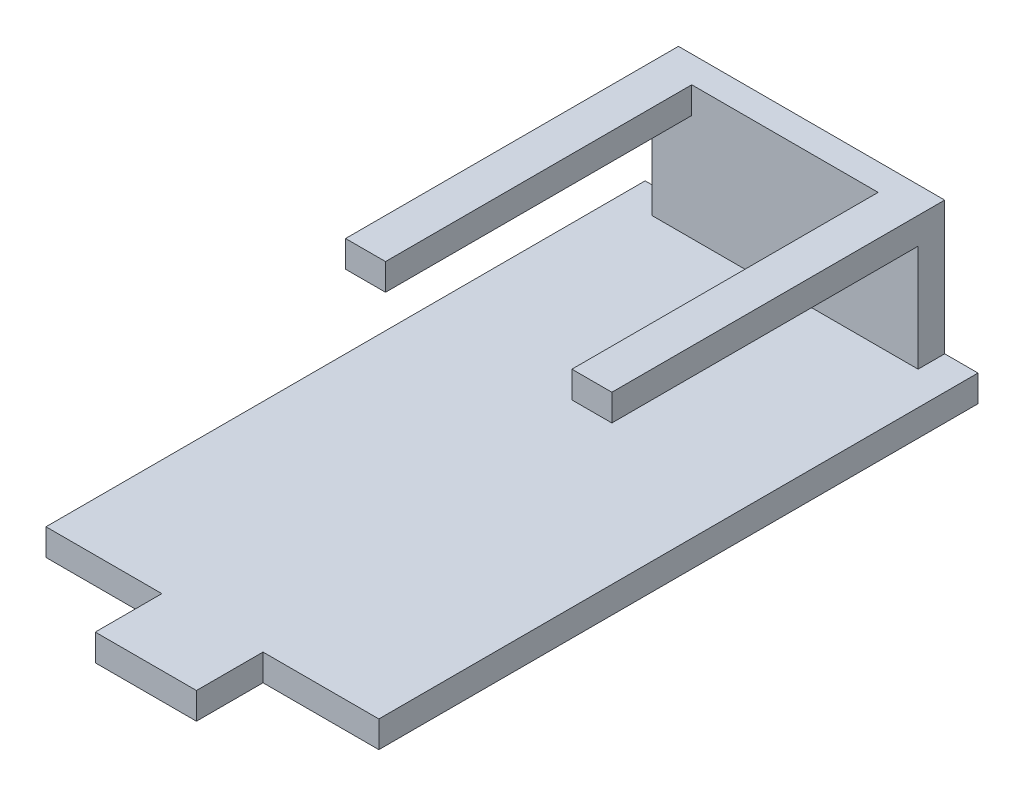
ISO-10303-21;
HEADER;
FILE_DESCRIPTION(('STEP AP214'),'2;1');
FILE_NAME('part.step','',(''),(''),'','','');
FILE_SCHEMA(('AUTOMOTIVE_DESIGN { 1 0 10303 214 1 1 1 1 }'));
ENDSEC;
DATA;
#1=APPLICATION_CONTEXT('core data for automotive mechanical design processes');
#2=APPLICATION_PROTOCOL_DEFINITION('international standard','automotive_design',2000,#1);
#3=PRODUCT_CONTEXT('',#1,'mechanical');
#4=PRODUCT('Part','Part','',(#3));
#5=PRODUCT_RELATED_PRODUCT_CATEGORY('part','',(#4));
#6=PRODUCT_DEFINITION_FORMATION('','',#4);
#7=PRODUCT_DEFINITION_CONTEXT('part definition',#1,'design');
#8=PRODUCT_DEFINITION('design','',#6,#7);
#9=PRODUCT_DEFINITION_SHAPE('','',#8);
#10=(LENGTH_UNIT() NAMED_UNIT(*) SI_UNIT(.MILLI.,.METRE.));
#11=(NAMED_UNIT(*) PLANE_ANGLE_UNIT() SI_UNIT($,.RADIAN.));
#12=(NAMED_UNIT(*) SI_UNIT($,.STERADIAN.) SOLID_ANGLE_UNIT());
#13=UNCERTAINTY_MEASURE_WITH_UNIT(LENGTH_MEASURE(1.E-05),#10,'distance_accuracy_value','');
#14=(GEOMETRIC_REPRESENTATION_CONTEXT(3) GLOBAL_UNCERTAINTY_ASSIGNED_CONTEXT((#13)) GLOBAL_UNIT_ASSIGNED_CONTEXT((#10,
#11,#12)) REPRESENTATION_CONTEXT('',''));
#15=CARTESIAN_POINT('',(0.,0.,0.));
#16=DIRECTION('',(0.,0.,1.));
#17=DIRECTION('',(1.,0.,0.));
#18=AXIS2_PLACEMENT_3D('',#15,#16,#17);
#19=CARTESIAN_POINT('',(-27.6262725772382,2.,-20.2907941728906));
#20=DIRECTION('',(1.,0.,0.));
#21=DIRECTION('',(0.,0.,-1.));
#22=AXIS2_PLACEMENT_3D('',#19,#20,#21);
#23=PLANE('',#22);
#24=DIRECTION('',(0.,-1.,0.));
#25=VECTOR('',#24,1.);
#26=CARTESIAN_POINT('',(-27.6262725772382,2.,24.7092058271093));
#27=LINE('',#26,#25);
#28=CARTESIAN_POINT('',(-27.6262725772382,2.,24.7092058271093));
#29=VERTEX_POINT('',#28);
#30=CARTESIAN_POINT('',(-27.6262725772382,0.,24.7092058271093));
#31=VERTEX_POINT('',#30);
#32=EDGE_CURVE('E57',#29,#31,#27,.T.);
#33=ORIENTED_EDGE('',*,*,#32,.F.);
#34=DIRECTION('',(0.,0.,1.));
#35=VECTOR('',#34,1.);
#36=CARTESIAN_POINT('',(-27.6262725772382,2.,-20.2907941728906));
#37=LINE('',#36,#35);
#38=CARTESIAN_POINT('',(-27.6262725772382,2.,-20.2907941728906));
#39=VERTEX_POINT('',#38);
#40=EDGE_CURVE('E266',#39,#29,#37,.T.);
#41=ORIENTED_EDGE('',*,*,#40,.F.);
#42=DIRECTION('',(0.,-1.,0.));
#43=VECTOR('',#42,1.);
#44=CARTESIAN_POINT('',(-27.6262725772382,2.,-20.2907941728906));
#45=LINE('',#44,#43);
#46=CARTESIAN_POINT('',(-27.6262725772382,0.,-20.2907941728906));
#47=VERTEX_POINT('',#46);
#48=EDGE_CURVE('E276',#39,#47,#45,.T.);
#49=ORIENTED_EDGE('',*,*,#48,.T.);
#50=DIRECTION('',(0.,0.,1.));
#51=VECTOR('',#50,1.);
#52=CARTESIAN_POINT('',(-27.6262725772382,0.,-20.2907941728906));
#53=LINE('',#52,#51);
#54=EDGE_CURVE('E265',#47,#31,#53,.T.);
#55=ORIENTED_EDGE('',*,*,#54,.T.);
#56=EDGE_LOOP('',(#33,#41,#49,#55));
#57=FACE_BOUND('',#56,.T.);
#58=ADVANCED_FACE('F35',(#57),#23,.F.);
#59=CARTESIAN_POINT('',(-25.1262725772382,10.,4.70920582710934));
#60=DIRECTION('',(0.,1.,0.));
#61=DIRECTION('',(0.,0.,1.));
#62=AXIS2_PLACEMENT_3D('',#59,#60,#61);
#63=PLANE('',#62);
#64=DIRECTION('',(1.,0.,0.));
#65=VECTOR('',#64,1.);
#66=CARTESIAN_POINT('',(-25.1262725772382,10.,-18.2907941728907));
#67=LINE('',#66,#65);
#68=CARTESIAN_POINT('',(-25.1262725772382,10.,-18.2907941728907));
#69=VERTEX_POINT('',#68);
#70=CARTESIAN_POINT('',(-22.1262725772382,10.,-18.2907941728907));
#71=VERTEX_POINT('',#70);
#72=EDGE_CURVE('E221',#69,#71,#67,.T.);
#73=ORIENTED_EDGE('',*,*,#72,.T.);
#74=DIRECTION('',(0.,0.,1.));
#75=VECTOR('',#74,1.);
#76=CARTESIAN_POINT('',(-22.1262725772382,10.,4.70920582710934));
#77=LINE('',#76,#75);
#78=CARTESIAN_POINT('',(-22.1262725772382,10.,4.70920582710934));
#79=VERTEX_POINT('',#78);
#80=EDGE_CURVE('E213',#71,#79,#77,.T.);
#81=ORIENTED_EDGE('',*,*,#80,.T.);
#82=DIRECTION('',(1.,0.,0.));
#83=VECTOR('',#82,1.);
#84=CARTESIAN_POINT('',(-25.1262725772382,10.,4.70920582710934));
#85=LINE('',#84,#83);
#86=CARTESIAN_POINT('',(-25.1262725772382,10.,4.70920582710934));
#87=VERTEX_POINT('',#86);
#88=EDGE_CURVE('E222',#87,#79,#85,.T.);
#89=ORIENTED_EDGE('',*,*,#88,.F.);
#90=DIRECTION('',(0.,0.,-1.));
#91=VECTOR('',#90,1.);
#92=CARTESIAN_POINT('',(-25.1262725772382,10.,4.70920582710934));
#93=LINE('',#92,#91);
#94=EDGE_CURVE('E237',#87,#69,#93,.T.);
#95=ORIENTED_EDGE('',*,*,#94,.T.);
#96=EDGE_LOOP('',(#73,#81,#89,#95));
#97=FACE_BOUND('',#96,.T.);
#98=ADVANCED_FACE('F334',(#97),#63,.F.);
#99=CARTESIAN_POINT('',(0.,0.,4.70920582710934));
#100=DIRECTION('',(0.,0.,1.));
#101=DIRECTION('',(1.,0.,0.));
#102=AXIS2_PLACEMENT_3D('',#99,#100,#101);
#103=PLANE('',#102);
#104=DIRECTION('',(0.,-1.,0.));
#105=VECTOR('',#104,1.);
#106=CARTESIAN_POINT('',(-22.1262725772382,0.,4.70920582710934));
#107=LINE('',#106,#105);
#108=CARTESIAN_POINT('',(-22.1262725772382,12.,4.70920582710934));
#109=VERTEX_POINT('',#108);
#110=EDGE_CURVE('E11',#109,#79,#107,.T.);
#111=ORIENTED_EDGE('',*,*,#110,.F.);
#112=DIRECTION('',(-1.,0.,0.));
#113=VECTOR('',#112,1.);
#114=CARTESIAN_POINT('',(-5.12627257723815,12.,4.70920582710934));
#115=LINE('',#114,#113);
#116=CARTESIAN_POINT('',(-25.1262725772382,12.,4.70920582710934));
#117=VERTEX_POINT('',#116);
#118=EDGE_CURVE('E228',#109,#117,#115,.T.);
#119=ORIENTED_EDGE('',*,*,#118,.T.);
#120=DIRECTION('',(0.,-1.,0.));
#121=VECTOR('',#120,1.);
#122=CARTESIAN_POINT('',(-25.1262725772382,12.,4.70920582710934));
#123=LINE('',#122,#121);
#124=EDGE_CURVE('E217',#117,#87,#123,.T.);
#125=ORIENTED_EDGE('',*,*,#124,.T.);
#126=ORIENTED_EDGE('',*,*,#88,.T.);
#127=EDGE_LOOP('',(#111,#119,#125,#126));
#128=FACE_BOUND('',#127,.T.);
#129=ADVANCED_FACE('F322',(#128),#103,.T.);
#130=CARTESIAN_POINT('',(-5.12627257723815,12.,-18.2907941728907));
#131=DIRECTION('',(0.,0.,-1.));
#132=DIRECTION('',(-1.,0.,0.));
#133=AXIS2_PLACEMENT_3D('',#130,#131,#132);
#134=PLANE('',#133);
#135=DIRECTION('',(0.,1.,0.));
#136=VECTOR('',#135,1.);
#137=CARTESIAN_POINT('',(-22.1262725772382,9.,-18.2907941728907));
#138=LINE('',#137,#136);
#139=CARTESIAN_POINT('',(-22.1262725772382,12.,-18.2907941728907));
#140=VERTEX_POINT('',#139);
#141=EDGE_CURVE('E207',#71,#140,#138,.T.);
#142=ORIENTED_EDGE('',*,*,#141,.F.);
#143=ORIENTED_EDGE('',*,*,#72,.F.);
#144=DIRECTION('',(0.,-1.,0.));
#145=VECTOR('',#144,1.);
#146=CARTESIAN_POINT('',(-25.1262725772382,12.,-18.2907941728907));
#147=LINE('',#146,#145);
#148=CARTESIAN_POINT('',(-25.1262725772382,2.,-18.2907941728907));
#149=VERTEX_POINT('',#148);
#150=EDGE_CURVE('E263',#69,#149,#147,.T.);
#151=ORIENTED_EDGE('',*,*,#150,.T.);
#152=DIRECTION('',(1.,0.,0.));
#153=VECTOR('',#152,1.);
#154=CARTESIAN_POINT('',(-5.12627257723815,2.,-18.2907941728907));
#155=LINE('',#154,#153);
#156=CARTESIAN_POINT('',(-5.12627257723815,2.,-18.2907941728907));
#157=VERTEX_POINT('',#156);
#158=EDGE_CURVE('E251',#149,#157,#155,.T.);
#159=ORIENTED_EDGE('',*,*,#158,.T.);
#160=DIRECTION('',(0.,-1.,0.));
#161=VECTOR('',#160,1.);
#162=CARTESIAN_POINT('',(-5.12627257723815,12.,-18.2907941728907));
#163=LINE('',#162,#161);
#164=CARTESIAN_POINT('',(-5.12627257723815,10.,-18.2907941728907));
#165=VERTEX_POINT('',#164);
#166=EDGE_CURVE('E261',#165,#157,#163,.T.);
#167=ORIENTED_EDGE('',*,*,#166,.F.);
#168=CARTESIAN_POINT('',(-8.12627257723815,10.,-18.2907941728907));
#169=VERTEX_POINT('',#168);
#170=EDGE_CURVE('E216',#169,#165,#67,.T.);
#171=ORIENTED_EDGE('',*,*,#170,.F.);
#172=DIRECTION('',(0.,1.,0.));
#173=VECTOR('',#172,1.);
#174=CARTESIAN_POINT('',(-8.12627257723815,9.,-18.2907941728907));
#175=LINE('',#174,#173);
#176=CARTESIAN_POINT('',(-8.12627257723815,12.,-18.2907941728907));
#177=VERTEX_POINT('',#176);
#178=EDGE_CURVE('E206',#169,#177,#175,.T.);
#179=ORIENTED_EDGE('',*,*,#178,.T.);
#180=DIRECTION('',(-1.,0.,0.));
#181=VECTOR('',#180,1.);
#182=CARTESIAN_POINT('',(-22.1262725772382,12.,-18.2907941728907));
#183=LINE('',#182,#181);
#184=EDGE_CURVE('E203',#177,#140,#183,.T.);
#185=ORIENTED_EDGE('',*,*,#184,.T.);
#186=EDGE_LOOP('',(#142,#143,#151,#159,#167,#171,#179,#185));
#187=FACE_BOUND('',#186,.T.);
#188=ADVANCED_FACE('F328',(#187),#134,.F.);
#189=CARTESIAN_POINT('',(-27.6262725772382,2.,29.7092058271093));
#190=DIRECTION('',(0.,0.,-1.));
#191=DIRECTION('',(-1.,0.,0.));
#192=AXIS2_PLACEMENT_3D('',#189,#190,#191);
#193=PLANE('',#192);
#194=DIRECTION('',(1.,0.,0.));
#195=VECTOR('',#194,1.);
#196=CARTESIAN_POINT('',(-27.6262725772382,0.,29.7092058271093));
#197=LINE('',#196,#195);
#198=CARTESIAN_POINT('',(-18.9262725772382,0.,29.7092058271093));
#199=VERTEX_POINT('',#198);
#200=CARTESIAN_POINT('',(-11.3262725772382,0.,29.7092058271093));
#201=VERTEX_POINT('',#200);
#202=EDGE_CURVE('E279',#199,#201,#197,.T.);
#203=ORIENTED_EDGE('',*,*,#202,.T.);
#204=DIRECTION('',(0.,-1.,0.));
#205=VECTOR('',#204,1.);
#206=CARTESIAN_POINT('',(-11.3262725772382,2.00000000000001,29.7092058271093));
#207=LINE('',#206,#205);
#208=CARTESIAN_POINT('',(-11.3262725772382,2.00000000000001,29.7092058271093));
#209=VERTEX_POINT('',#208);
#210=EDGE_CURVE('E172',#209,#201,#207,.T.);
#211=ORIENTED_EDGE('',*,*,#210,.F.);
#212=DIRECTION('',(1.,0.,0.));
#213=VECTOR('',#212,1.);
#214=CARTESIAN_POINT('',(-27.6262725772382,2.,29.7092058271093));
#215=LINE('',#214,#213);
#216=CARTESIAN_POINT('',(-18.9262725772382,2.00000000000001,29.7092058271093));
#217=VERTEX_POINT('',#216);
#218=EDGE_CURVE('E178',#217,#209,#215,.T.);
#219=ORIENTED_EDGE('',*,*,#218,.F.);
#220=DIRECTION('',(0.,1.,0.));
#221=VECTOR('',#220,1.);
#222=CARTESIAN_POINT('',(-18.9262725772382,0.,29.7092058271093));
#223=LINE('',#222,#221);
#224=EDGE_CURVE('E180',#199,#217,#223,.T.);
#225=ORIENTED_EDGE('',*,*,#224,.F.);
#226=EDGE_LOOP('',(#203,#211,#219,#225));
#227=FACE_BOUND('',#226,.T.);
#228=ADVANCED_FACE('F363',(#227),#193,.F.);
#229=CARTESIAN_POINT('',(-2.62627257723815,2.,29.7092058271093));
#230=DIRECTION('',(-1.,0.,0.));
#231=DIRECTION('',(0.,0.,1.));
#232=AXIS2_PLACEMENT_3D('',#229,#230,#231);
#233=PLANE('',#232);
#234=DIRECTION('',(0.,0.,-1.));
#235=VECTOR('',#234,1.);
#236=CARTESIAN_POINT('',(-2.62627257723815,2.,29.7092058271093));
#237=LINE('',#236,#235);
#238=CARTESIAN_POINT('',(-2.62627257723815,2.,24.7092058271093));
#239=VERTEX_POINT('',#238);
#240=CARTESIAN_POINT('',(-2.62627257723815,2.,-20.2907941728907));
#241=VERTEX_POINT('',#240);
#242=EDGE_CURVE('E271',#239,#241,#237,.T.);
#243=ORIENTED_EDGE('',*,*,#242,.F.);
#244=DIRECTION('',(0.,1.,0.));
#245=VECTOR('',#244,1.);
#246=CARTESIAN_POINT('',(-2.62627257723815,2.,24.7092058271093));
#247=LINE('',#246,#245);
#248=CARTESIAN_POINT('',(-2.62627257723815,0.,24.7092058271093));
#249=VERTEX_POINT('',#248);
#250=EDGE_CURVE('E169',#249,#239,#247,.T.);
#251=ORIENTED_EDGE('',*,*,#250,.F.);
#252=DIRECTION('',(0.,0.,-1.));
#253=VECTOR('',#252,1.);
#254=CARTESIAN_POINT('',(-2.62627257723815,0.,29.7092058271093));
#255=LINE('',#254,#253);
#256=CARTESIAN_POINT('',(-2.62627257723815,0.,-20.2907941728907));
#257=VERTEX_POINT('',#256);
#258=EDGE_CURVE('E282',#249,#257,#255,.T.);
#259=ORIENTED_EDGE('',*,*,#258,.T.);
#260=DIRECTION('',(0.,-1.,0.));
#261=VECTOR('',#260,1.);
#262=CARTESIAN_POINT('',(-2.62627257723815,2.,-20.2907941728907));
#263=LINE('',#262,#261);
#264=EDGE_CURVE('E287',#241,#257,#263,.T.);
#265=ORIENTED_EDGE('',*,*,#264,.F.);
#266=EDGE_LOOP('',(#243,#251,#259,#265));
#267=FACE_BOUND('',#266,.T.);
#268=ADVANCED_FACE('F366',(#267),#233,.F.);
#269=CARTESIAN_POINT('',(-2.62627257723815,2.,-20.2907941728907));
#270=DIRECTION('',(0.,0.,1.));
#271=DIRECTION('',(1.,0.,0.));
#272=AXIS2_PLACEMENT_3D('',#269,#270,#271);
#273=PLANE('',#272);
#274=DIRECTION('',(-1.,0.,0.));
#275=VECTOR('',#274,1.);
#276=CARTESIAN_POINT('',(-2.62627257723815,0.,-20.2907941728907));
#277=LINE('',#276,#275);
#278=EDGE_CURVE('E269',#257,#47,#277,.T.);
#279=ORIENTED_EDGE('',*,*,#278,.T.);
#280=ORIENTED_EDGE('',*,*,#48,.F.);
#281=DIRECTION('',(-1.,0.,0.));
#282=VECTOR('',#281,1.);
#283=CARTESIAN_POINT('',(-2.62627257723815,2.,-20.2907941728907));
#284=LINE('',#283,#282);
#285=CARTESIAN_POINT('',(-25.1262725772382,2.,-20.2907941728906));
#286=VERTEX_POINT('',#285);
#287=EDGE_CURVE('E273',#286,#39,#284,.T.);
#288=ORIENTED_EDGE('',*,*,#287,.F.);
#289=DIRECTION('',(0.,-1.,0.));
#290=VECTOR('',#289,1.);
#291=CARTESIAN_POINT('',(-25.1262725772382,12.,-20.2907941728906));
#292=LINE('',#291,#290);
#293=CARTESIAN_POINT('',(-25.1262725772382,12.,-20.2907941728906));
#294=VERTEX_POINT('',#293);
#295=EDGE_CURVE('E248',#294,#286,#292,.T.);
#296=ORIENTED_EDGE('',*,*,#295,.F.);
#297=DIRECTION('',(-1.,0.,0.));
#298=VECTOR('',#297,1.);
#299=CARTESIAN_POINT('',(-25.1262725772382,12.,-20.2907941728906));
#300=LINE('',#299,#298);
#301=CARTESIAN_POINT('',(-5.12627257723815,12.,-20.2907941728907));
#302=VERTEX_POINT('',#301);
#303=EDGE_CURVE('E246',#302,#294,#300,.T.);
#304=ORIENTED_EDGE('',*,*,#303,.F.);
#305=DIRECTION('',(0.,-1.,0.));
#306=VECTOR('',#305,1.);
#307=CARTESIAN_POINT('',(-5.12627257723815,12.,-20.2907941728907));
#308=LINE('',#307,#306);
#309=CARTESIAN_POINT('',(-5.12627257723815,2.,-20.2907941728907));
#310=VERTEX_POINT('',#309);
#311=EDGE_CURVE('E258',#302,#310,#308,.T.);
#312=ORIENTED_EDGE('',*,*,#311,.T.);
#313=EDGE_CURVE('E274',#241,#310,#284,.T.);
#314=ORIENTED_EDGE('',*,*,#313,.F.);
#315=ORIENTED_EDGE('',*,*,#264,.T.);
#316=EDGE_LOOP('',(#279,#280,#288,#296,#304,#312,#314,#315));
#317=FACE_BOUND('',#316,.T.);
#318=ADVANCED_FACE('F314',(#317),#273,.F.);
#319=CARTESIAN_POINT('',(0.,2.,0.));
#320=DIRECTION('',(0.,1.,0.));
#321=DIRECTION('',(0.,0.,1.));
#322=AXIS2_PLACEMENT_3D('',#319,#320,#321);
#323=PLANE('',#322);
#324=DIRECTION('',(0.,0.,1.));
#325=VECTOR('',#324,1.);
#326=CARTESIAN_POINT('',(-11.3262725772382,2.00000000000001,24.7092058271093));
#327=LINE('',#326,#325);
#328=CARTESIAN_POINT('',(-11.3262725772382,2.00000000000001,24.7092058271093));
#329=VERTEX_POINT('',#328);
#330=EDGE_CURVE('E158',#329,#209,#327,.T.);
#331=ORIENTED_EDGE('',*,*,#330,.F.);
#332=DIRECTION('',(-1.,0.,0.));
#333=VECTOR('',#332,1.);
#334=CARTESIAN_POINT('',(-11.3262725772382,2.00000000000001,24.7092058271093));
#335=LINE('',#334,#333);
#336=EDGE_CURVE('E164',#239,#329,#335,.T.);
#337=ORIENTED_EDGE('',*,*,#336,.F.);
#338=ORIENTED_EDGE('',*,*,#242,.T.);
#339=ORIENTED_EDGE('',*,*,#313,.T.);
#340=DIRECTION('',(0.,0.,-1.));
#341=VECTOR('',#340,1.);
#342=CARTESIAN_POINT('',(-5.12627257723815,2.,-20.2907941728907));
#343=LINE('',#342,#341);
#344=EDGE_CURVE('E244',#157,#310,#343,.T.);
#345=ORIENTED_EDGE('',*,*,#344,.F.);
#346=ORIENTED_EDGE('',*,*,#158,.F.);
#347=DIRECTION('',(0.,0.,1.));
#348=VECTOR('',#347,1.);
#349=CARTESIAN_POINT('',(-25.1262725772382,2.,-18.2907941728907));
#350=LINE('',#349,#348);
#351=EDGE_CURVE('E239',#286,#149,#350,.T.);
#352=ORIENTED_EDGE('',*,*,#351,.F.);
#353=ORIENTED_EDGE('',*,*,#287,.T.);
#354=ORIENTED_EDGE('',*,*,#40,.T.);
#355=DIRECTION('',(-1.,0.,0.));
#356=VECTOR('',#355,1.);
#357=CARTESIAN_POINT('',(-18.9262725772382,2.00000000000001,24.7092058271093));
#358=LINE('',#357,#356);
#359=CARTESIAN_POINT('',(-18.9262725772382,2.00000000000001,24.7092058271093));
#360=VERTEX_POINT('',#359);
#361=EDGE_CURVE('E185',#360,#29,#358,.T.);
#362=ORIENTED_EDGE('',*,*,#361,.F.);
#363=DIRECTION('',(0.,0.,1.));
#364=VECTOR('',#363,1.);
#365=CARTESIAN_POINT('',(-18.9262725772382,2.00000000000001,24.7092058271093));
#366=LINE('',#365,#364);
#367=EDGE_CURVE('E195',#360,#217,#366,.T.);
#368=ORIENTED_EDGE('',*,*,#367,.T.);
#369=ORIENTED_EDGE('',*,*,#218,.T.);
#370=EDGE_LOOP('',(#331,#337,#338,#339,#345,#346,#352,#353,#354,#362,#368,#369));
#371=FACE_BOUND('',#370,.T.);
#372=ADVANCED_FACE('F175',(#371),#323,.T.);
#373=CARTESIAN_POINT('',(0.,0.,0.));
#374=DIRECTION('',(0.,1.,0.));
#375=DIRECTION('',(0.,0.,1.));
#376=AXIS2_PLACEMENT_3D('',#373,#374,#375);
#377=PLANE('',#376);
#378=DIRECTION('',(1.,0.,0.));
#379=VECTOR('',#378,1.);
#380=CARTESIAN_POINT('',(-2.62627257723815,0.,24.7092058271093));
#381=LINE('',#380,#379);
#382=CARTESIAN_POINT('',(-11.3262725772382,0.,24.7092058271093));
#383=VERTEX_POINT('',#382);
#384=EDGE_CURVE('E163',#383,#249,#381,.T.);
#385=ORIENTED_EDGE('',*,*,#384,.F.);
#386=DIRECTION('',(0.,0.,1.));
#387=VECTOR('',#386,1.);
#388=CARTESIAN_POINT('',(-11.3262725772382,0.,24.7092058271093));
#389=LINE('',#388,#387);
#390=EDGE_CURVE('E161',#383,#201,#389,.T.);
#391=ORIENTED_EDGE('',*,*,#390,.T.);
#392=ORIENTED_EDGE('',*,*,#202,.F.);
#393=DIRECTION('',(0.,0.,1.));
#394=VECTOR('',#393,1.);
#395=CARTESIAN_POINT('',(-18.9262725772382,0.,24.7092058271093));
#396=LINE('',#395,#394);
#397=CARTESIAN_POINT('',(-18.9262725772382,0.,24.7092058271093));
#398=VERTEX_POINT('',#397);
#399=EDGE_CURVE('E193',#398,#199,#396,.T.);
#400=ORIENTED_EDGE('',*,*,#399,.F.);
#401=DIRECTION('',(1.,0.,0.));
#402=VECTOR('',#401,1.);
#403=CARTESIAN_POINT('',(-27.6262725772382,0.,24.7092058271093));
#404=LINE('',#403,#402);
#405=EDGE_CURVE('E188',#31,#398,#404,.T.);
#406=ORIENTED_EDGE('',*,*,#405,.F.);
#407=ORIENTED_EDGE('',*,*,#54,.F.);
#408=ORIENTED_EDGE('',*,*,#278,.F.);
#409=ORIENTED_EDGE('',*,*,#258,.F.);
#410=EDGE_LOOP('',(#385,#391,#392,#400,#406,#407,#408,#409));
#411=FACE_BOUND('',#410,.T.);
#412=ADVANCED_FACE('F353',(#411),#377,.F.);
#413=CARTESIAN_POINT('',(-25.1262725772382,12.,-18.2907941728907));
#414=DIRECTION('',(1.,0.,0.));
#415=DIRECTION('',(0.,0.,-1.));
#416=AXIS2_PLACEMENT_3D('',#413,#414,#415);
#417=PLANE('',#416);
#418=ORIENTED_EDGE('',*,*,#351,.T.);
#419=ORIENTED_EDGE('',*,*,#150,.F.);
#420=ORIENTED_EDGE('',*,*,#94,.F.);
#421=ORIENTED_EDGE('',*,*,#124,.F.);
#422=DIRECTION('',(0.,0.,1.));
#423=VECTOR('',#422,1.);
#424=CARTESIAN_POINT('',(-25.1262725772382,12.,-18.2907941728907));
#425=LINE('',#424,#423);
#426=EDGE_CURVE('E240',#294,#117,#425,.T.);
#427=ORIENTED_EDGE('',*,*,#426,.F.);
#428=ORIENTED_EDGE('',*,*,#295,.T.);
#429=EDGE_LOOP('',(#418,#419,#420,#421,#427,#428));
#430=FACE_BOUND('',#429,.T.);
#431=ADVANCED_FACE('F317',(#430),#417,.F.);
#432=CARTESIAN_POINT('',(-5.12627257723815,12.,-20.2907941728907));
#433=DIRECTION('',(-1.,0.,0.));
#434=DIRECTION('',(0.,0.,1.));
#435=AXIS2_PLACEMENT_3D('',#432,#433,#434);
#436=PLANE('',#435);
#437=ORIENTED_EDGE('',*,*,#344,.T.);
#438=ORIENTED_EDGE('',*,*,#311,.F.);
#439=DIRECTION('',(0.,0.,-1.));
#440=VECTOR('',#439,1.);
#441=CARTESIAN_POINT('',(-5.12627257723815,12.,-20.2907941728907));
#442=LINE('',#441,#440);
#443=CARTESIAN_POINT('',(-5.12627257723815,12.,4.70920582710934));
#444=VERTEX_POINT('',#443);
#445=EDGE_CURVE('E243',#444,#302,#442,.T.);
#446=ORIENTED_EDGE('',*,*,#445,.F.);
#447=DIRECTION('',(0.,1.,0.));
#448=VECTOR('',#447,1.);
#449=CARTESIAN_POINT('',(-5.12627257723815,10.,4.70920582710934));
#450=LINE('',#449,#448);
#451=CARTESIAN_POINT('',(-5.12627257723815,10.,4.70920582710934));
#452=VERTEX_POINT('',#451);
#453=EDGE_CURVE('E225',#452,#444,#450,.T.);
#454=ORIENTED_EDGE('',*,*,#453,.F.);
#455=DIRECTION('',(0.,0.,-1.));
#456=VECTOR('',#455,1.);
#457=CARTESIAN_POINT('',(-5.12627257723815,10.,4.70920582710934));
#458=LINE('',#457,#456);
#459=EDGE_CURVE('E232',#452,#165,#458,.T.);
#460=ORIENTED_EDGE('',*,*,#459,.T.);
#461=ORIENTED_EDGE('',*,*,#166,.T.);
#462=EDGE_LOOP('',(#437,#438,#446,#454,#460,#461));
#463=FACE_BOUND('',#462,.T.);
#464=ADVANCED_FACE('F305',(#463),#436,.F.);
#465=CARTESIAN_POINT('',(0.,12.,0.));
#466=DIRECTION('',(0.,-1.,0.));
#467=DIRECTION('',(0.,0.,-1.));
#468=AXIS2_PLACEMENT_3D('',#465,#466,#467);
#469=PLANE('',#468);
#470=ORIENTED_EDGE('',*,*,#118,.F.);
#471=DIRECTION('',(0.,0.,1.));
#472=VECTOR('',#471,1.);
#473=CARTESIAN_POINT('',(-22.1262725772382,12.,4.70920582710934));
#474=LINE('',#473,#472);
#475=EDGE_CURVE('E197',#140,#109,#474,.T.);
#476=ORIENTED_EDGE('',*,*,#475,.F.);
#477=ORIENTED_EDGE('',*,*,#184,.F.);
#478=DIRECTION('',(0.,0.,-1.));
#479=VECTOR('',#478,1.);
#480=CARTESIAN_POINT('',(-8.12627257723815,12.,-18.2907941728907));
#481=LINE('',#480,#479);
#482=CARTESIAN_POINT('',(-8.12627257723815,12.,4.70920582710934));
#483=VERTEX_POINT('',#482);
#484=EDGE_CURVE('E200',#483,#177,#481,.T.);
#485=ORIENTED_EDGE('',*,*,#484,.F.);
#486=EDGE_CURVE('E229',#444,#483,#115,.T.);
#487=ORIENTED_EDGE('',*,*,#486,.F.);
#488=ORIENTED_EDGE('',*,*,#445,.T.);
#489=ORIENTED_EDGE('',*,*,#303,.T.);
#490=ORIENTED_EDGE('',*,*,#426,.T.);
#491=EDGE_LOOP('',(#470,#476,#477,#485,#487,#488,#489,#490));
#492=FACE_BOUND('',#491,.T.);
#493=ADVANCED_FACE('F299',(#492),#469,.F.);
#494=CARTESIAN_POINT('',(-8.12627257723815,10.,4.70920582710934));
#495=VERTEX_POINT('',#494);
#496=EDGE_CURVE('E220',#495,#452,#85,.T.);
#497=ORIENTED_EDGE('',*,*,#496,.F.);
#498=DIRECTION('',(0.,0.,-1.));
#499=VECTOR('',#498,1.);
#500=CARTESIAN_POINT('',(-8.12627257723815,10.,4.70920582710934));
#501=LINE('',#500,#499);
#502=EDGE_CURVE('E209',#495,#169,#501,.T.);
#503=ORIENTED_EDGE('',*,*,#502,.T.);
#504=ORIENTED_EDGE('',*,*,#170,.T.);
#505=ORIENTED_EDGE('',*,*,#459,.F.);
#506=EDGE_LOOP('',(#497,#503,#504,#505));
#507=FACE_BOUND('',#506,.T.);
#508=ADVANCED_FACE('F331',(#507),#63,.F.);
#509=DIRECTION('',(0.,1.,0.));
#510=VECTOR('',#509,1.);
#511=CARTESIAN_POINT('',(-8.12627257723815,0.,4.70920582710934));
#512=LINE('',#511,#510);
#513=EDGE_CURVE('E42',#495,#483,#512,.T.);
#514=ORIENTED_EDGE('',*,*,#513,.F.);
#515=ORIENTED_EDGE('',*,*,#496,.T.);
#516=ORIENTED_EDGE('',*,*,#453,.T.);
#517=ORIENTED_EDGE('',*,*,#486,.T.);
#518=EDGE_LOOP('',(#514,#515,#516,#517));
#519=FACE_BOUND('',#518,.T.);
#520=ADVANCED_FACE('F301',(#519),#103,.T.);
#521=CARTESIAN_POINT('',(-22.1262725772382,9.,4.70920582710934));
#522=DIRECTION('',(-1.,0.,0.));
#523=DIRECTION('',(0.,0.,1.));
#524=AXIS2_PLACEMENT_3D('',#521,#522,#523);
#525=PLANE('',#524);
#526=ORIENTED_EDGE('',*,*,#141,.T.);
#527=ORIENTED_EDGE('',*,*,#475,.T.);
#528=ORIENTED_EDGE('',*,*,#110,.T.);
#529=ORIENTED_EDGE('',*,*,#80,.F.);
#530=EDGE_LOOP('',(#526,#527,#528,#529));
#531=FACE_BOUND('',#530,.T.);
#532=ADVANCED_FACE('F324',(#531),#525,.F.);
#533=CARTESIAN_POINT('',(-8.12627257723815,9.,-18.2907941728907));
#534=DIRECTION('',(1.,0.,0.));
#535=DIRECTION('',(0.,0.,-1.));
#536=AXIS2_PLACEMENT_3D('',#533,#534,#535);
#537=PLANE('',#536);
#538=ORIENTED_EDGE('',*,*,#513,.T.);
#539=ORIENTED_EDGE('',*,*,#484,.T.);
#540=ORIENTED_EDGE('',*,*,#178,.F.);
#541=ORIENTED_EDGE('',*,*,#502,.F.);
#542=EDGE_LOOP('',(#538,#539,#540,#541));
#543=FACE_BOUND('',#542,.T.);
#544=ADVANCED_FACE('F292',(#543),#537,.F.);
#545=CARTESIAN_POINT('',(-18.9262725772382,0.,24.7092058271093));
#546=DIRECTION('',(1.,0.,0.));
#547=DIRECTION('',(0.,0.,-1.));
#548=AXIS2_PLACEMENT_3D('',#545,#546,#547);
#549=PLANE('',#548);
#550=ORIENTED_EDGE('',*,*,#224,.T.);
#551=ORIENTED_EDGE('',*,*,#367,.F.);
#552=DIRECTION('',(0.,1.,0.));
#553=VECTOR('',#552,1.);
#554=CARTESIAN_POINT('',(-18.9262725772382,0.,24.7092058271093));
#555=LINE('',#554,#553);
#556=EDGE_CURVE('E190',#398,#360,#555,.T.);
#557=ORIENTED_EDGE('',*,*,#556,.F.);
#558=ORIENTED_EDGE('',*,*,#399,.T.);
#559=EDGE_LOOP('',(#550,#551,#557,#558));
#560=FACE_BOUND('',#559,.T.);
#561=ADVANCED_FACE('F360',(#560),#549,.F.);
#562=CARTESIAN_POINT('',(0.,0.,24.7092058271093));
#563=DIRECTION('',(0.,0.,1.));
#564=DIRECTION('',(1.,0.,0.));
#565=AXIS2_PLACEMENT_3D('',#562,#563,#564);
#566=PLANE('',#565);
#567=ORIENTED_EDGE('',*,*,#361,.T.);
#568=ORIENTED_EDGE('',*,*,#32,.T.);
#569=ORIENTED_EDGE('',*,*,#405,.T.);
#570=ORIENTED_EDGE('',*,*,#556,.T.);
#571=EDGE_LOOP('',(#567,#568,#569,#570));
#572=FACE_BOUND('',#571,.T.);
#573=ADVANCED_FACE('F358',(#572),#566,.T.);
#574=CARTESIAN_POINT('',(-11.3262725772382,2.00000000000001,24.7092058271093));
#575=DIRECTION('',(-1.,0.,0.));
#576=DIRECTION('',(0.,0.,1.));
#577=AXIS2_PLACEMENT_3D('',#574,#575,#576);
#578=PLANE('',#577);
#579=ORIENTED_EDGE('',*,*,#210,.T.);
#580=ORIENTED_EDGE('',*,*,#390,.F.);
#581=DIRECTION('',(0.,-1.,0.));
#582=VECTOR('',#581,1.);
#583=CARTESIAN_POINT('',(-11.3262725772382,2.00000000000001,24.7092058271093));
#584=LINE('',#583,#582);
#585=EDGE_CURVE('E49',#329,#383,#584,.T.);
#586=ORIENTED_EDGE('',*,*,#585,.F.);
#587=ORIENTED_EDGE('',*,*,#330,.T.);
#588=EDGE_LOOP('',(#579,#580,#586,#587));
#589=FACE_BOUND('',#588,.T.);
#590=ADVANCED_FACE('F156',(#589),#578,.F.);
#591=CARTESIAN_POINT('',(0.,0.,24.7092058271093));
#592=DIRECTION('',(0.,0.,-1.));
#593=DIRECTION('',(-1.,0.,0.));
#594=AXIS2_PLACEMENT_3D('',#591,#592,#593);
#595=PLANE('',#594);
#596=ORIENTED_EDGE('',*,*,#336,.T.);
#597=ORIENTED_EDGE('',*,*,#585,.T.);
#598=ORIENTED_EDGE('',*,*,#384,.T.);
#599=ORIENTED_EDGE('',*,*,#250,.T.);
#600=EDGE_LOOP('',(#596,#597,#598,#599));
#601=FACE_BOUND('',#600,.T.);
#602=ADVANCED_FACE('F167',(#601),#595,.F.);
#603=CLOSED_SHELL('',(#58,#98,#129,#188,#228,#268,#318,#372,#412,#431,#464,#493,#508,#520,#532,
#544,#561,#573,#590,#602));
#604=MANIFOLD_SOLID_BREP('B2',#603);
#605=ADVANCED_BREP_SHAPE_REPRESENTATION('',(#18,#604),#14);
#606=SHAPE_DEFINITION_REPRESENTATION(#9,#605);
ENDSEC;
END-ISO-10303-21;
